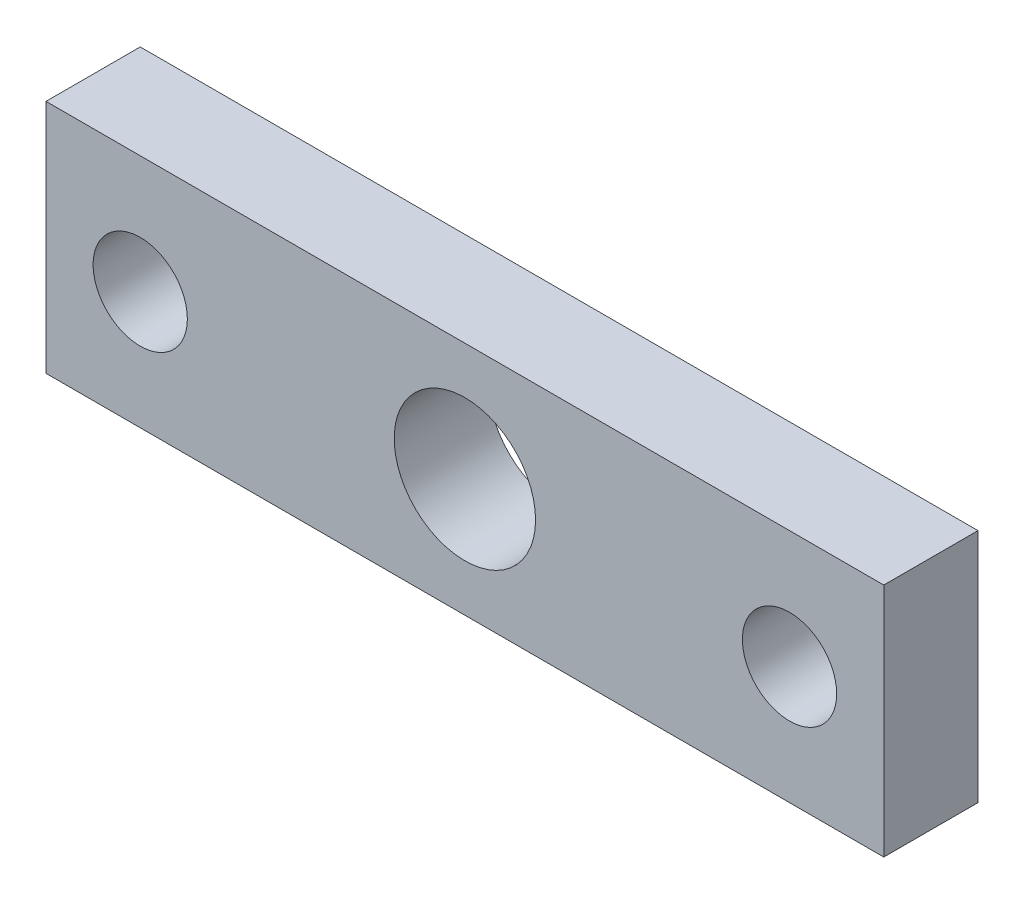
ISO-10303-21;
HEADER;
FILE_DESCRIPTION(('STEP AP214'),'2;1');
FILE_NAME('part.step','',(''),(''),'','','');
FILE_SCHEMA(('AUTOMOTIVE_DESIGN { 1 0 10303 214 1 1 1 1 }'));
ENDSEC;
DATA;
#1=APPLICATION_CONTEXT('core data for automotive mechanical design processes');
#2=APPLICATION_PROTOCOL_DEFINITION('international standard','automotive_design',2000,#1);
#3=PRODUCT_CONTEXT('',#1,'mechanical');
#4=PRODUCT('Part','Part','',(#3));
#5=PRODUCT_RELATED_PRODUCT_CATEGORY('part','',(#4));
#6=PRODUCT_DEFINITION_FORMATION('','',#4);
#7=PRODUCT_DEFINITION_CONTEXT('part definition',#1,'design');
#8=PRODUCT_DEFINITION('design','',#6,#7);
#9=PRODUCT_DEFINITION_SHAPE('','',#8);
#10=(LENGTH_UNIT() NAMED_UNIT(*) SI_UNIT(.MILLI.,.METRE.));
#11=(NAMED_UNIT(*) PLANE_ANGLE_UNIT() SI_UNIT($,.RADIAN.));
#12=(NAMED_UNIT(*) SI_UNIT($,.STERADIAN.) SOLID_ANGLE_UNIT());
#13=UNCERTAINTY_MEASURE_WITH_UNIT(LENGTH_MEASURE(1.E-05),#10,'distance_accuracy_value','');
#14=(GEOMETRIC_REPRESENTATION_CONTEXT(3) GLOBAL_UNCERTAINTY_ASSIGNED_CONTEXT((#13)) GLOBAL_UNIT_ASSIGNED_CONTEXT((#10,
#11,#12)) REPRESENTATION_CONTEXT('',''));
#15=CARTESIAN_POINT('',(0.,0.,0.));
#16=DIRECTION('',(0.,0.,1.));
#17=DIRECTION('',(1.,0.,0.));
#18=AXIS2_PLACEMENT_3D('',#15,#16,#17);
#19=CARTESIAN_POINT('',(0.,0.,10.));
#20=DIRECTION('',(1.,0.,0.));
#21=DIRECTION('',(0.,0.,-1.));
#22=AXIS2_PLACEMENT_3D('',#19,#20,#21);
#23=PLANE('',#22);
#24=DIRECTION('',(0.,-1.,0.));
#25=VECTOR('',#24,1.);
#26=CARTESIAN_POINT('',(0.,0.,0.));
#27=LINE('',#26,#25);
#28=CARTESIAN_POINT('',(0.,25.,0.));
#29=VERTEX_POINT('',#28);
#30=CARTESIAN_POINT('',(0.,0.,0.));
#31=VERTEX_POINT('',#30);
#32=EDGE_CURVE('E96',#29,#31,#27,.T.);
#33=ORIENTED_EDGE('',*,*,#32,.T.);
#34=DIRECTION('',(0.,0.,-1.));
#35=VECTOR('',#34,1.);
#36=CARTESIAN_POINT('',(0.,0.,10.));
#37=LINE('',#36,#35);
#38=CARTESIAN_POINT('',(0.,0.,10.));
#39=VERTEX_POINT('',#38);
#40=EDGE_CURVE('E11',#39,#31,#37,.T.);
#41=ORIENTED_EDGE('',*,*,#40,.F.);
#42=DIRECTION('',(0.,-1.,0.));
#43=VECTOR('',#42,1.);
#44=CARTESIAN_POINT('',(0.,0.,10.));
#45=LINE('',#44,#43);
#46=CARTESIAN_POINT('',(0.,25.,10.));
#47=VERTEX_POINT('',#46);
#48=EDGE_CURVE('E84',#47,#39,#45,.T.);
#49=ORIENTED_EDGE('',*,*,#48,.F.);
#50=DIRECTION('',(0.,0.,-1.));
#51=VECTOR('',#50,1.);
#52=CARTESIAN_POINT('',(0.,25.,10.));
#53=LINE('',#52,#51);
#54=EDGE_CURVE('E92',#47,#29,#53,.T.);
#55=ORIENTED_EDGE('',*,*,#54,.T.);
#56=EDGE_LOOP('',(#33,#41,#49,#55));
#57=FACE_BOUND('',#56,.T.);
#58=ADVANCED_FACE('F33',(#57),#23,.F.);
#59=CARTESIAN_POINT('',(0.,0.,10.));
#60=DIRECTION('',(0.,1.,0.));
#61=DIRECTION('',(0.,0.,1.));
#62=AXIS2_PLACEMENT_3D('',#59,#60,#61);
#63=PLANE('',#62);
#64=DIRECTION('',(1.,0.,0.));
#65=VECTOR('',#64,1.);
#66=CARTESIAN_POINT('',(0.,0.,0.));
#67=LINE('',#66,#65);
#68=CARTESIAN_POINT('',(88.9,0.,0.));
#69=VERTEX_POINT('',#68);
#70=EDGE_CURVE('E88',#31,#69,#67,.T.);
#71=ORIENTED_EDGE('',*,*,#70,.T.);
#72=DIRECTION('',(0.,0.,-1.));
#73=VECTOR('',#72,1.);
#74=CARTESIAN_POINT('',(88.9,0.,10.));
#75=LINE('',#74,#73);
#76=CARTESIAN_POINT('',(88.9,0.,10.));
#77=VERTEX_POINT('',#76);
#78=EDGE_CURVE('E41',#77,#69,#75,.T.);
#79=ORIENTED_EDGE('',*,*,#78,.F.);
#80=DIRECTION('',(1.,0.,0.));
#81=VECTOR('',#80,1.);
#82=CARTESIAN_POINT('',(0.,0.,10.));
#83=LINE('',#82,#81);
#84=EDGE_CURVE('E79',#39,#77,#83,.T.);
#85=ORIENTED_EDGE('',*,*,#84,.F.);
#86=ORIENTED_EDGE('',*,*,#40,.T.);
#87=EDGE_LOOP('',(#71,#79,#85,#86));
#88=FACE_BOUND('',#87,.T.);
#89=ADVANCED_FACE('F87',(#88),#63,.F.);
#90=CARTESIAN_POINT('',(88.9,0.,10.));
#91=DIRECTION('',(-1.,0.,0.));
#92=DIRECTION('',(0.,0.,1.));
#93=AXIS2_PLACEMENT_3D('',#90,#91,#92);
#94=PLANE('',#93);
#95=DIRECTION('',(0.,1.,0.));
#96=VECTOR('',#95,1.);
#97=CARTESIAN_POINT('',(88.9,0.,0.));
#98=LINE('',#97,#96);
#99=CARTESIAN_POINT('',(88.9,25.,0.));
#100=VERTEX_POINT('',#99);
#101=EDGE_CURVE('E66',#69,#100,#98,.T.);
#102=ORIENTED_EDGE('',*,*,#101,.T.);
#103=DIRECTION('',(0.,0.,-1.));
#104=VECTOR('',#103,1.);
#105=CARTESIAN_POINT('',(88.9,25.,10.));
#106=LINE('',#105,#104);
#107=CARTESIAN_POINT('',(88.9,25.,10.));
#108=VERTEX_POINT('',#107);
#109=EDGE_CURVE('E89',#108,#100,#106,.T.);
#110=ORIENTED_EDGE('',*,*,#109,.F.);
#111=DIRECTION('',(0.,1.,0.));
#112=VECTOR('',#111,1.);
#113=CARTESIAN_POINT('',(88.9,0.,10.));
#114=LINE('',#113,#112);
#115=EDGE_CURVE('E82',#77,#108,#114,.T.);
#116=ORIENTED_EDGE('',*,*,#115,.F.);
#117=ORIENTED_EDGE('',*,*,#78,.T.);
#118=EDGE_LOOP('',(#102,#110,#116,#117));
#119=FACE_BOUND('',#118,.T.);
#120=ADVANCED_FACE('F90',(#119),#94,.F.);
#121=CARTESIAN_POINT('',(0.,25.,10.));
#122=DIRECTION('',(0.,-1.,0.));
#123=DIRECTION('',(0.,0.,-1.));
#124=AXIS2_PLACEMENT_3D('',#121,#122,#123);
#125=PLANE('',#124);
#126=DIRECTION('',(-1.,0.,0.));
#127=VECTOR('',#126,1.);
#128=CARTESIAN_POINT('',(0.,25.,0.));
#129=LINE('',#128,#127);
#130=EDGE_CURVE('E72',#100,#29,#129,.T.);
#131=ORIENTED_EDGE('',*,*,#130,.T.);
#132=ORIENTED_EDGE('',*,*,#54,.F.);
#133=DIRECTION('',(-1.,0.,0.));
#134=VECTOR('',#133,1.);
#135=CARTESIAN_POINT('',(0.,25.,10.));
#136=LINE('',#135,#134);
#137=EDGE_CURVE('E49',#108,#47,#136,.T.);
#138=ORIENTED_EDGE('',*,*,#137,.F.);
#139=ORIENTED_EDGE('',*,*,#109,.T.);
#140=EDGE_LOOP('',(#131,#132,#138,#139));
#141=FACE_BOUND('',#140,.T.);
#142=ADVANCED_FACE('F104',(#141),#125,.F.);
#143=CARTESIAN_POINT('',(0.,0.,10.));
#144=DIRECTION('',(0.,0.,-1.));
#145=DIRECTION('',(-1.,0.,0.));
#146=AXIS2_PLACEMENT_3D('',#143,#144,#145);
#147=PLANE('',#146);
#148=CARTESIAN_POINT('',(44.45,12.5,10.));
#149=DIRECTION('',(0.,0.,1.));
#150=DIRECTION('',(1.,0.,0.));
#151=AXIS2_PLACEMENT_3D('',#148,#149,#150);
#152=CIRCLE('',#151,7.5);
#153=CARTESIAN_POINT('',(51.95,12.5,10.));
#154=VERTEX_POINT('',#153);
#155=EDGE_CURVE('E122',#154,#154,#152,.T.);
#156=ORIENTED_EDGE('',*,*,#155,.F.);
#157=EDGE_LOOP('',(#156));
#158=FACE_BOUND('',#157,.T.);
#159=CARTESIAN_POINT('',(78.9,12.5,10.));
#160=DIRECTION('',(0.,0.,1.));
#161=DIRECTION('',(1.,0.,0.));
#162=AXIS2_PLACEMENT_3D('',#159,#160,#161);
#163=CIRCLE('',#162,5.);
#164=CARTESIAN_POINT('',(83.9,12.5,10.));
#165=VERTEX_POINT('',#164);
#166=EDGE_CURVE('E116',#165,#165,#163,.T.);
#167=ORIENTED_EDGE('',*,*,#166,.F.);
#168=EDGE_LOOP('',(#167));
#169=FACE_BOUND('',#168,.T.);
#170=CARTESIAN_POINT('',(10.,12.5,10.));
#171=DIRECTION('',(0.,0.,1.));
#172=DIRECTION('',(1.,0.,0.));
#173=AXIS2_PLACEMENT_3D('',#170,#171,#172);
#174=CIRCLE('',#173,5.);
#175=CARTESIAN_POINT('',(15.,12.5,10.));
#176=VERTEX_POINT('',#175);
#177=EDGE_CURVE('E110',#176,#176,#174,.T.);
#178=ORIENTED_EDGE('',*,*,#177,.F.);
#179=EDGE_LOOP('',(#178));
#180=FACE_BOUND('',#179,.T.);
#181=ORIENTED_EDGE('',*,*,#48,.T.);
#182=ORIENTED_EDGE('',*,*,#84,.T.);
#183=ORIENTED_EDGE('',*,*,#115,.T.);
#184=ORIENTED_EDGE('',*,*,#137,.T.);
#185=EDGE_LOOP('',(#181,#182,#183,#184));
#186=FACE_BOUND('',#185,.T.);
#187=ADVANCED_FACE('F80',(#158,#169,#180,#186),#147,.F.);
#188=CARTESIAN_POINT('',(0.,0.,0.));
#189=DIRECTION('',(0.,0.,-1.));
#190=DIRECTION('',(-1.,0.,0.));
#191=AXIS2_PLACEMENT_3D('',#188,#189,#190);
#192=PLANE('',#191);
#193=CARTESIAN_POINT('',(44.45,12.5,0.));
#194=DIRECTION('',(0.,0.,1.));
#195=DIRECTION('',(1.,0.,0.));
#196=AXIS2_PLACEMENT_3D('',#193,#194,#195);
#197=CIRCLE('',#196,7.5);
#198=CARTESIAN_POINT('',(51.95,12.5,0.));
#199=VERTEX_POINT('',#198);
#200=EDGE_CURVE('E119',#199,#199,#197,.T.);
#201=ORIENTED_EDGE('',*,*,#200,.T.);
#202=EDGE_LOOP('',(#201));
#203=FACE_BOUND('',#202,.T.);
#204=CARTESIAN_POINT('',(78.9,12.5,0.));
#205=DIRECTION('',(0.,0.,1.));
#206=DIRECTION('',(1.,0.,0.));
#207=AXIS2_PLACEMENT_3D('',#204,#205,#206);
#208=CIRCLE('',#207,5.);
#209=CARTESIAN_POINT('',(83.9,12.5,0.));
#210=VERTEX_POINT('',#209);
#211=EDGE_CURVE('E113',#210,#210,#208,.T.);
#212=ORIENTED_EDGE('',*,*,#211,.T.);
#213=EDGE_LOOP('',(#212));
#214=FACE_BOUND('',#213,.T.);
#215=CARTESIAN_POINT('',(10.,12.5,0.));
#216=DIRECTION('',(0.,0.,1.));
#217=DIRECTION('',(1.,0.,0.));
#218=AXIS2_PLACEMENT_3D('',#215,#216,#217);
#219=CIRCLE('',#218,5.);
#220=CARTESIAN_POINT('',(15.,12.5,0.));
#221=VERTEX_POINT('',#220);
#222=EDGE_CURVE('E99',#221,#221,#219,.T.);
#223=ORIENTED_EDGE('',*,*,#222,.T.);
#224=EDGE_LOOP('',(#223));
#225=FACE_BOUND('',#224,.T.);
#226=ORIENTED_EDGE('',*,*,#32,.F.);
#227=ORIENTED_EDGE('',*,*,#130,.F.);
#228=ORIENTED_EDGE('',*,*,#101,.F.);
#229=ORIENTED_EDGE('',*,*,#70,.F.);
#230=EDGE_LOOP('',(#226,#227,#228,#229));
#231=FACE_BOUND('',#230,.T.);
#232=ADVANCED_FACE('F107',(#203,#214,#225,#231),#192,.T.);
#233=CARTESIAN_POINT('',(10.,12.5,0.));
#234=DIRECTION('',(0.,0.,1.));
#235=DIRECTION('',(1.,0.,0.));
#236=AXIS2_PLACEMENT_3D('',#233,#234,#235);
#237=CYLINDRICAL_SURFACE('',#236,5.);
#238=ORIENTED_EDGE('',*,*,#222,.F.);
#239=EDGE_LOOP('',(#238));
#240=FACE_BOUND('',#239,.T.);
#241=ORIENTED_EDGE('',*,*,#177,.T.);
#242=EDGE_LOOP('',(#241));
#243=FACE_BOUND('',#242,.T.);
#244=ADVANCED_FACE('F144',(#240,#243),#237,.F.);
#245=CARTESIAN_POINT('',(78.9,12.5,0.));
#246=DIRECTION('',(0.,0.,1.));
#247=DIRECTION('',(1.,0.,0.));
#248=AXIS2_PLACEMENT_3D('',#245,#246,#247);
#249=CYLINDRICAL_SURFACE('',#248,5.);
#250=ORIENTED_EDGE('',*,*,#211,.F.);
#251=EDGE_LOOP('',(#250));
#252=FACE_BOUND('',#251,.T.);
#253=ORIENTED_EDGE('',*,*,#166,.T.);
#254=EDGE_LOOP('',(#253));
#255=FACE_BOUND('',#254,.T.);
#256=ADVANCED_FACE('F133',(#252,#255),#249,.F.);
#257=CARTESIAN_POINT('',(44.45,12.5,0.));
#258=DIRECTION('',(0.,0.,1.));
#259=DIRECTION('',(1.,0.,0.));
#260=AXIS2_PLACEMENT_3D('',#257,#258,#259);
#261=CYLINDRICAL_SURFACE('',#260,7.5);
#262=ORIENTED_EDGE('',*,*,#200,.F.);
#263=EDGE_LOOP('',(#262));
#264=FACE_BOUND('',#263,.T.);
#265=ORIENTED_EDGE('',*,*,#155,.T.);
#266=EDGE_LOOP('',(#265));
#267=FACE_BOUND('',#266,.T.);
#268=ADVANCED_FACE('F130',(#264,#267),#261,.F.);
#269=CLOSED_SHELL('',(#58,#89,#120,#142,#187,#232,#244,#256,#268));
#270=MANIFOLD_SOLID_BREP('B2',#269);
#271=ADVANCED_BREP_SHAPE_REPRESENTATION('',(#18,#270),#14);
#272=SHAPE_DEFINITION_REPRESENTATION(#9,#271);
ENDSEC;
END-ISO-10303-21;
